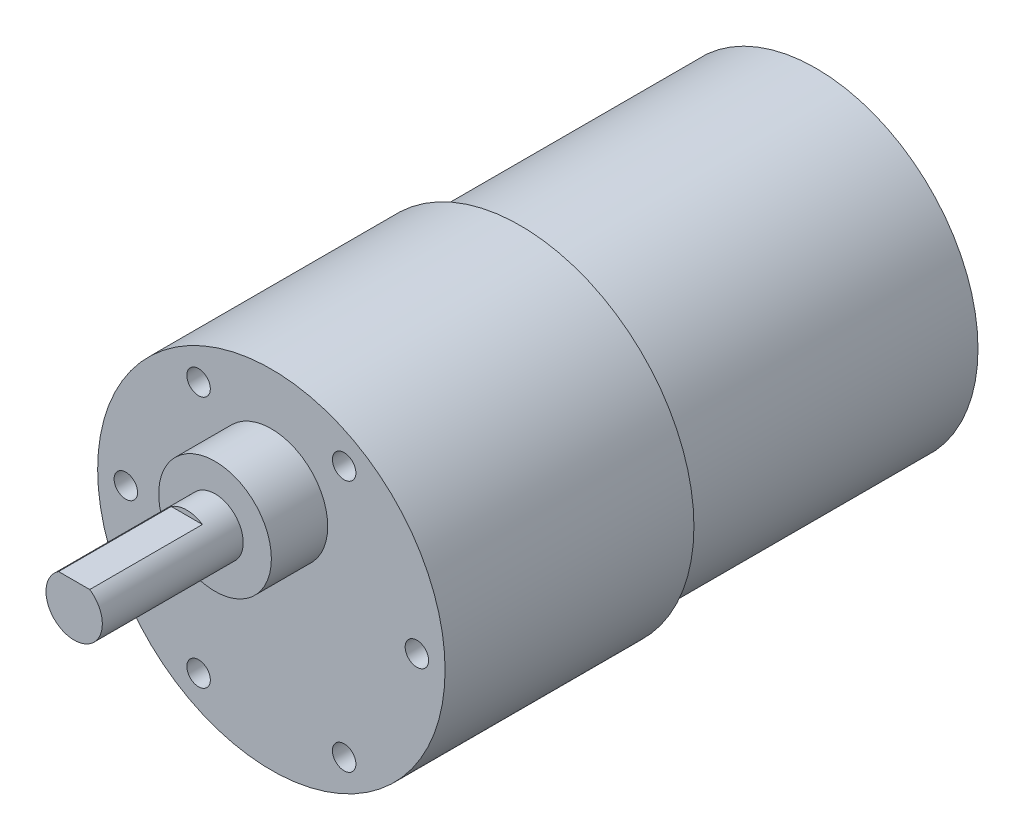
ISO-10303-21;
HEADER;
FILE_DESCRIPTION(('STEP AP214'),'2;1');
FILE_NAME('part.step','',(''),(''),'','','');
FILE_SCHEMA(('AUTOMOTIVE_DESIGN { 1 0 10303 214 1 1 1 1 }'));
ENDSEC;
DATA;
#1=APPLICATION_CONTEXT('core data for automotive mechanical design processes');
#2=APPLICATION_PROTOCOL_DEFINITION('international standard','automotive_design',2000,#1);
#3=PRODUCT_CONTEXT('',#1,'mechanical');
#4=PRODUCT('Part','Part','',(#3));
#5=PRODUCT_RELATED_PRODUCT_CATEGORY('part','',(#4));
#6=PRODUCT_DEFINITION_FORMATION('','',#4);
#7=PRODUCT_DEFINITION_CONTEXT('part definition',#1,'design');
#8=PRODUCT_DEFINITION('design','',#6,#7);
#9=PRODUCT_DEFINITION_SHAPE('','',#8);
#10=(LENGTH_UNIT() NAMED_UNIT(*) SI_UNIT(.MILLI.,.METRE.));
#11=(NAMED_UNIT(*) PLANE_ANGLE_UNIT() SI_UNIT($,.RADIAN.));
#12=(NAMED_UNIT(*) SI_UNIT($,.STERADIAN.) SOLID_ANGLE_UNIT());
#13=UNCERTAINTY_MEASURE_WITH_UNIT(LENGTH_MEASURE(1.E-05),#10,'distance_accuracy_value','');
#14=(GEOMETRIC_REPRESENTATION_CONTEXT(3) GLOBAL_UNCERTAINTY_ASSIGNED_CONTEXT((#13)) GLOBAL_UNIT_ASSIGNED_CONTEXT((#10,
#11,#12)) REPRESENTATION_CONTEXT('',''));
#15=CARTESIAN_POINT('',(0.,0.,0.));
#16=DIRECTION('',(0.,0.,1.));
#17=DIRECTION('',(1.,0.,0.));
#18=AXIS2_PLACEMENT_3D('',#15,#16,#17);
#19=CARTESIAN_POINT('',(0.,0.,29.));
#20=DIRECTION('',(0.,0.,-1.));
#21=DIRECTION('',(-1.,0.,0.));
#22=AXIS2_PLACEMENT_3D('',#19,#20,#21);
#23=CYLINDRICAL_SURFACE('',#22,18.5);
#24=CARTESIAN_POINT('',(0.,0.,29.));
#25=DIRECTION('',(0.,0.,1.));
#26=DIRECTION('',(1.,0.,0.));
#27=AXIS2_PLACEMENT_3D('',#24,#25,#26);
#28=CIRCLE('',#27,18.5);
#29=CARTESIAN_POINT('',(-18.5,0.,29.));
#30=VERTEX_POINT('',#29);
#31=EDGE_CURVE('E11',#30,#30,#28,.T.);
#32=CARTESIAN_POINT('',(0.,0.,2.5));
#33=DIRECTION('',(0.,0.,-1.));
#34=DIRECTION('',(-1.,0.,0.));
#35=AXIS2_PLACEMENT_3D('',#32,#33,#34);
#36=CIRCLE('',#35,18.5);
#37=CARTESIAN_POINT('',(-18.5,0.,2.5));
#38=VERTEX_POINT('',#37);
#39=EDGE_CURVE('E41',#38,#38,#36,.T.);
#40=CARTESIAN_POINT('',(-18.5,0.,29.));
#41=CARTESIAN_POINT('',(-18.5,0.,28.7239583333333));
#42=CARTESIAN_POINT('',(-18.5,0.,28.4479166666667));
#43=CARTESIAN_POINT('',(-18.5,0.,27.8958333333333));
#44=CARTESIAN_POINT('',(-18.5,0.,27.6197916666667));
#45=CARTESIAN_POINT('',(-18.5,0.,27.0677083333333));
#46=CARTESIAN_POINT('',(-18.5,0.,26.7916666666667));
#47=CARTESIAN_POINT('',(-18.5,0.,26.2395833333333));
#48=CARTESIAN_POINT('',(-18.5,0.,25.9635416666667));
#49=CARTESIAN_POINT('',(-18.5,0.,25.4114583333333));
#50=CARTESIAN_POINT('',(-18.5,0.,25.1354166666667));
#51=CARTESIAN_POINT('',(-18.5,0.,24.5833333333333));
#52=CARTESIAN_POINT('',(-18.5,0.,24.3072916666667));
#53=CARTESIAN_POINT('',(-18.5,0.,23.7552083333333));
#54=CARTESIAN_POINT('',(-18.5,0.,23.4791666666667));
#55=CARTESIAN_POINT('',(-18.5,0.,22.9270833333333));
#56=CARTESIAN_POINT('',(-18.5,0.,22.6510416666667));
#57=CARTESIAN_POINT('',(-18.5,0.,22.0989583333333));
#58=CARTESIAN_POINT('',(-18.5,0.,21.8229166666667));
#59=CARTESIAN_POINT('',(-18.5,0.,21.2708333333333));
#60=CARTESIAN_POINT('',(-18.5,0.,20.9947916666667));
#61=CARTESIAN_POINT('',(-18.5,0.,20.4427083333333));
#62=CARTESIAN_POINT('',(-18.5,0.,20.1666666666667));
#63=CARTESIAN_POINT('',(-18.5,0.,19.6145833333333));
#64=CARTESIAN_POINT('',(-18.5,0.,19.3385416666667));
#65=CARTESIAN_POINT('',(-18.5,0.,18.7864583333333));
#66=CARTESIAN_POINT('',(-18.5,0.,18.5104166666667));
#67=CARTESIAN_POINT('',(-18.5,0.,17.9583333333333));
#68=CARTESIAN_POINT('',(-18.5,0.,17.6822916666667));
#69=CARTESIAN_POINT('',(-18.5,0.,17.1302083333333));
#70=CARTESIAN_POINT('',(-18.5,0.,16.8541666666667));
#71=CARTESIAN_POINT('',(-18.5,0.,16.3020833333333));
#72=CARTESIAN_POINT('',(-18.5,0.,16.0260416666667));
#73=CARTESIAN_POINT('',(-18.5,0.,15.4739583333333));
#74=CARTESIAN_POINT('',(-18.5,0.,15.1979166666667));
#75=CARTESIAN_POINT('',(-18.5,0.,14.6458333333333));
#76=CARTESIAN_POINT('',(-18.5,0.,14.3697916666667));
#77=CARTESIAN_POINT('',(-18.5,0.,13.8177083333333));
#78=CARTESIAN_POINT('',(-18.5,0.,13.5416666666667));
#79=CARTESIAN_POINT('',(-18.5,0.,12.9895833333333));
#80=CARTESIAN_POINT('',(-18.5,0.,12.7135416666667));
#81=CARTESIAN_POINT('',(-18.5,0.,12.1614583333333));
#82=CARTESIAN_POINT('',(-18.5,0.,11.8854166666667));
#83=CARTESIAN_POINT('',(-18.5,0.,11.3333333333333));
#84=CARTESIAN_POINT('',(-18.5,0.,11.0572916666667));
#85=CARTESIAN_POINT('',(-18.5,0.,10.5052083333333));
#86=CARTESIAN_POINT('',(-18.5,0.,10.2291666666667));
#87=CARTESIAN_POINT('',(-18.5,0.,9.67708333333334));
#88=CARTESIAN_POINT('',(-18.5,0.,9.40104166666667));
#89=CARTESIAN_POINT('',(-18.5,0.,8.84895833333334));
#90=CARTESIAN_POINT('',(-18.5,0.,8.57291666666667));
#91=CARTESIAN_POINT('',(-18.5,0.,8.02083333333334));
#92=CARTESIAN_POINT('',(-18.5,0.,7.74479166666667));
#93=CARTESIAN_POINT('',(-18.5,0.,7.19270833333334));
#94=CARTESIAN_POINT('',(-18.5,0.,6.91666666666667));
#95=CARTESIAN_POINT('',(-18.5,0.,6.36458333333334));
#96=CARTESIAN_POINT('',(-18.5,0.,6.08854166666667));
#97=CARTESIAN_POINT('',(-18.5,0.,5.53645833333333));
#98=CARTESIAN_POINT('',(-18.5,0.,5.26041666666667));
#99=CARTESIAN_POINT('',(-18.5,0.,4.70833333333334));
#100=CARTESIAN_POINT('',(-18.5,0.,4.43229166666667));
#101=CARTESIAN_POINT('',(-18.5,0.,3.88020833333334));
#102=CARTESIAN_POINT('',(-18.5,0.,3.60416666666667));
#103=CARTESIAN_POINT('',(-18.5,0.,3.05208333333333));
#104=CARTESIAN_POINT('',(-18.5,0.,2.77604166666667));
#105=CARTESIAN_POINT('',(-18.5,0.,2.5));
#106=B_SPLINE_CURVE_WITH_KNOTS('',3,(#40,#41,#42,#43,#44,#45,#46,#47,#48,#49,#50,#51,#52,#53,
#54,#55,#56,#57,#58,#59,#60,#61,#62,#63,#64,#65,#66,#67,#68,#69,#70,#71,#72,#73,#74,#75,#76,#77,
#78,#79,#80,#81,#82,#83,#84,#85,#86,#87,#88,#89,#90,#91,#92,#93,#94,#95,#96,#97,#98,#99,#100,
#101,#102,#103,#104,#105),.UNSPECIFIED.,.F.,.F.,(4,2,2,2,2,2,2,2,2,2,2,2,2,2,2,2,2,2,2,2,2,2,2,
2,2,2,2,2,2,2,2,2,4),(0.,0.828125000000002,1.65625,2.484375,3.3125,4.140625,4.96875,5.796875,
6.625,7.453125,8.28125,9.109375,9.9375,10.765625,11.59375,12.421875,13.25,14.078125,14.90625,
15.734375,16.5625,17.390625,18.21875,19.046875,19.875,20.703125,21.53125,22.359375,23.1875,
24.015625,24.84375,25.671875,26.5),.UNSPECIFIED.);
#107=EDGE_CURVE('BSEAM34',#30,#38,#106,.T.);
#108=ORIENTED_EDGE('',*,*,#31,.F.);
#109=ORIENTED_EDGE('',*,*,#39,.F.);
#110=ORIENTED_EDGE('',*,*,#107,.T.);
#111=ORIENTED_EDGE('',*,*,#107,.F.);
#112=EDGE_LOOP('',(#108,#110,#109,#111));
#113=FACE_BOUND('',#112,.T.);
#114=ADVANCED_FACE('F34',(#113),#23,.T.);
#115=CARTESIAN_POINT('',(0.,0.,29.));
#116=DIRECTION('',(0.,0.,1.));
#117=DIRECTION('',(1.,0.,0.));
#118=AXIS2_PLACEMENT_3D('',#115,#116,#117);
#119=PLANE('',#118);
#120=CARTESIAN_POINT('',(-15.5,0.,29.));
#121=DIRECTION('',(0.,0.,1.));
#122=DIRECTION('',(-0.500000000000004,0.866025403784436,0.));
#123=AXIS2_PLACEMENT_3D('',#120,#121,#122);
#124=CIRCLE('',#123,1.24999999999999);
#125=CARTESIAN_POINT('',(-16.125,1.08253175473048,29.));
#126=VERTEX_POINT('',#125);
#127=EDGE_CURVE('E91',#126,#126,#124,.T.);
#128=ORIENTED_EDGE('',*,*,#127,.F.);
#129=EDGE_LOOP('',(#128));
#130=FACE_BOUND('',#129,.T.);
#131=CARTESIAN_POINT('',(-7.75000000000002,-13.4233937586588,29.));
#132=DIRECTION('',(0.,0.,1.));
#133=DIRECTION('',(-1.,0.,0.));
#134=AXIS2_PLACEMENT_3D('',#131,#132,#133);
#135=CIRCLE('',#134,1.24999999999999);
#136=CARTESIAN_POINT('',(-9.00000000000001,-13.4233937586588,29.));
#137=VERTEX_POINT('',#136);
#138=EDGE_CURVE('E100',#137,#137,#135,.T.);
#139=ORIENTED_EDGE('',*,*,#138,.F.);
#140=EDGE_LOOP('',(#139));
#141=FACE_BOUND('',#140,.T.);
#142=CARTESIAN_POINT('',(7.75000000000011,-13.4233937586587,29.));
#143=DIRECTION('',(0.,0.,1.));
#144=DIRECTION('',(-0.499999999999992,-0.866025403784443,0.));
#145=AXIS2_PLACEMENT_3D('',#142,#143,#144);
#146=CIRCLE('',#145,1.24999999999999);
#147=CARTESIAN_POINT('',(7.12500000000012,-14.5059255133893,29.));
#148=VERTEX_POINT('',#147);
#149=EDGE_CURVE('E106',#148,#148,#146,.T.);
#150=ORIENTED_EDGE('',*,*,#149,.F.);
#151=EDGE_LOOP('',(#150));
#152=FACE_BOUND('',#151,.T.);
#153=CARTESIAN_POINT('',(15.5,1.62196645003831E-13,29.));
#154=DIRECTION('',(0.,0.,1.));
#155=DIRECTION('',(0.50000000000001,-0.866025403784433,0.));
#156=AXIS2_PLACEMENT_3D('',#153,#154,#155);
#157=CIRCLE('',#156,1.24999999999999);
#158=CARTESIAN_POINT('',(16.125,-1.08253175473037,29.));
#159=VERTEX_POINT('',#158);
#160=EDGE_CURVE('E112',#159,#159,#157,.T.);
#161=ORIENTED_EDGE('',*,*,#160,.F.);
#162=EDGE_LOOP('',(#161));
#163=FACE_BOUND('',#162,.T.);
#164=CARTESIAN_POINT('',(-7.75000000000002,13.4233937586588,29.));
#165=DIRECTION('',(0.,0.,1.));
#166=DIRECTION('',(0.499999999999998,0.86602540378444,0.));
#167=AXIS2_PLACEMENT_3D('',#164,#165,#166);
#168=CIRCLE('',#167,1.24999999999999);
#169=CARTESIAN_POINT('',(-7.12500000000002,14.5059255133893,29.));
#170=VERTEX_POINT('',#169);
#171=EDGE_CURVE('E90',#170,#170,#168,.T.);
#172=ORIENTED_EDGE('',*,*,#171,.F.);
#173=EDGE_LOOP('',(#172));
#174=FACE_BOUND('',#173,.T.);
#175=CARTESIAN_POINT('',(7.75000000000002,13.4233937586588,29.));
#176=DIRECTION('',(0.,0.,1.));
#177=DIRECTION('',(1.,0.,0.));
#178=AXIS2_PLACEMENT_3D('',#175,#176,#177);
#179=CIRCLE('',#178,1.24999999999999);
#180=CARTESIAN_POINT('',(9.00000000000001,13.4233937586588,29.));
#181=VERTEX_POINT('',#180);
#182=EDGE_CURVE('E119',#181,#181,#179,.T.);
#183=ORIENTED_EDGE('',*,*,#182,.F.);
#184=EDGE_LOOP('',(#183));
#185=FACE_BOUND('',#184,.T.);
#186=CARTESIAN_POINT('',(0.,7.,29.));
#187=DIRECTION('',(0.,0.,1.));
#188=DIRECTION('',(1.,0.,0.));
#189=AXIS2_PLACEMENT_3D('',#186,#187,#188);
#190=CIRCLE('',#189,6.);
#191=CARTESIAN_POINT('',(6.,7.,29.));
#192=VERTEX_POINT('',#191);
#193=EDGE_CURVE('E136',#192,#192,#190,.T.);
#194=ORIENTED_EDGE('',*,*,#193,.F.);
#195=EDGE_LOOP('',(#194));
#196=FACE_BOUND('',#195,.T.);
#197=ORIENTED_EDGE('',*,*,#31,.T.);
#198=EDGE_LOOP('',(#197));
#199=FACE_BOUND('',#198,.T.);
#200=ADVANCED_FACE('F155',(#130,#141,#152,#163,#174,#185,#196,#199),#119,.T.);
#201=CARTESIAN_POINT('',(0.,0.,2.5));
#202=DIRECTION('',(0.,0.,-1.));
#203=DIRECTION('',(-1.,0.,0.));
#204=AXIS2_PLACEMENT_3D('',#201,#202,#203);
#205=PLANE('',#204);
#206=CARTESIAN_POINT('',(0.,0.,2.5));
#207=DIRECTION('',(0.,0.,-1.));
#208=DIRECTION('',(-1.,0.,0.));
#209=AXIS2_PLACEMENT_3D('',#206,#207,#208);
#210=CIRCLE('',#209,17.25);
#211=CARTESIAN_POINT('',(-17.25,0.,2.5));
#212=VERTEX_POINT('',#211);
#213=EDGE_CURVE('E145',#212,#212,#210,.T.);
#214=ORIENTED_EDGE('',*,*,#213,.F.);
#215=EDGE_LOOP('',(#214));
#216=FACE_BOUND('',#215,.T.);
#217=ORIENTED_EDGE('',*,*,#39,.T.);
#218=EDGE_LOOP('',(#217));
#219=FACE_BOUND('',#218,.T.);
#220=ADVANCED_FACE('F152',(#216,#219),#205,.T.);
#221=CARTESIAN_POINT('',(0.,0.,2.5));
#222=DIRECTION('',(0.,0.,-1.));
#223=DIRECTION('',(-1.,0.,0.));
#224=AXIS2_PLACEMENT_3D('',#221,#222,#223);
#225=CYLINDRICAL_SURFACE('',#224,17.25);
#226=ORIENTED_EDGE('',*,*,#213,.T.);
#227=EDGE_LOOP('',(#226));
#228=FACE_BOUND('',#227,.T.);
#229=CARTESIAN_POINT('',(0.,0.,-29.));
#230=DIRECTION('',(0.,0.,-1.));
#231=DIRECTION('',(-1.,0.,0.));
#232=AXIS2_PLACEMENT_3D('',#229,#230,#231);
#233=CIRCLE('',#232,17.25);
#234=CARTESIAN_POINT('',(-17.25,0.,-29.));
#235=VERTEX_POINT('',#234);
#236=EDGE_CURVE('E142',#235,#235,#233,.T.);
#237=ORIENTED_EDGE('',*,*,#236,.F.);
#238=EDGE_LOOP('',(#237));
#239=FACE_BOUND('',#238,.T.);
#240=ADVANCED_FACE('F167',(#228,#239),#225,.T.);
#241=CARTESIAN_POINT('',(0.,0.,-29.));
#242=DIRECTION('',(0.,0.,1.));
#243=DIRECTION('',(1.,0.,0.));
#244=AXIS2_PLACEMENT_3D('',#241,#242,#243);
#245=PLANE('',#244);
#246=ORIENTED_EDGE('',*,*,#236,.T.);
#247=EDGE_LOOP('',(#246));
#248=FACE_BOUND('',#247,.T.);
#249=ADVANCED_FACE('F173',(#248),#245,.F.);
#250=CARTESIAN_POINT('',(0.,7.,35.));
#251=DIRECTION('',(0.,0.,-1.));
#252=DIRECTION('',(-1.,0.,0.));
#253=AXIS2_PLACEMENT_3D('',#250,#251,#252);
#254=CYLINDRICAL_SURFACE('',#253,6.);
#255=CARTESIAN_POINT('',(0.,7.,35.));
#256=DIRECTION('',(0.,0.,1.));
#257=DIRECTION('',(1.,0.,0.));
#258=AXIS2_PLACEMENT_3D('',#255,#256,#257);
#259=CIRCLE('',#258,6.);
#260=CARTESIAN_POINT('',(6.,7.,35.));
#261=VERTEX_POINT('',#260);
#262=EDGE_CURVE('E139',#261,#261,#259,.T.);
#263=ORIENTED_EDGE('',*,*,#262,.F.);
#264=EDGE_LOOP('',(#263));
#265=FACE_BOUND('',#264,.T.);
#266=ORIENTED_EDGE('',*,*,#193,.T.);
#267=EDGE_LOOP('',(#266));
#268=FACE_BOUND('',#267,.T.);
#269=ADVANCED_FACE('F175',(#265,#268),#254,.T.);
#270=CARTESIAN_POINT('',(0.,7.,35.));
#271=DIRECTION('',(0.,0.,1.));
#272=DIRECTION('',(1.,0.,0.));
#273=AXIS2_PLACEMENT_3D('',#270,#271,#272);
#274=PLANE('',#273);
#275=CARTESIAN_POINT('',(0.,7.,35.));
#276=DIRECTION('',(0.,0.,1.));
#277=DIRECTION('',(1.,0.,0.));
#278=AXIS2_PLACEMENT_3D('',#275,#276,#277);
#279=CIRCLE('',#278,3.);
#280=CARTESIAN_POINT('',(3.,7.,35.));
#281=VERTEX_POINT('',#280);
#282=EDGE_CURVE('E131',#281,#281,#279,.T.);
#283=ORIENTED_EDGE('',*,*,#282,.F.);
#284=EDGE_LOOP('',(#283));
#285=FACE_BOUND('',#284,.T.);
#286=ORIENTED_EDGE('',*,*,#262,.T.);
#287=EDGE_LOOP('',(#286));
#288=FACE_BOUND('',#287,.T.);
#289=ADVANCED_FACE('F181',(#285,#288),#274,.T.);
#290=CARTESIAN_POINT('',(0.,7.,50.));
#291=DIRECTION('',(0.,0.,-1.));
#292=DIRECTION('',(-1.,0.,0.));
#293=AXIS2_PLACEMENT_3D('',#290,#291,#292);
#294=CYLINDRICAL_SURFACE('',#293,3.);
#295=CARTESIAN_POINT('',(0.,7.,50.));
#296=DIRECTION('',(0.,0.,1.));
#297=DIRECTION('',(1.,0.,0.));
#298=AXIS2_PLACEMENT_3D('',#295,#296,#297);
#299=CIRCLE('',#298,3.);
#300=CARTESIAN_POINT('',(-1.6583123951777,9.5,50.));
#301=VERTEX_POINT('',#300);
#302=CARTESIAN_POINT('',(1.6583123951777,9.5,50.));
#303=VERTEX_POINT('',#302);
#304=EDGE_CURVE('E133',#301,#303,#299,.T.);
#305=ORIENTED_EDGE('',*,*,#304,.F.);
#306=DIRECTION('',(0.,0.,1.));
#307=VECTOR('',#306,1.);
#308=CARTESIAN_POINT('',(-1.6583123951777,9.5,38.));
#309=LINE('',#308,#307);
#310=CARTESIAN_POINT('',(-1.6583123951777,9.5,38.));
#311=VERTEX_POINT('',#310);
#312=EDGE_CURVE('E48',#311,#301,#309,.T.);
#313=ORIENTED_EDGE('',*,*,#312,.F.);
#314=CARTESIAN_POINT('',(0.,7.,38.));
#315=DIRECTION('',(0.,0.,1.));
#316=DIRECTION('',(1.,0.,0.));
#317=AXIS2_PLACEMENT_3D('',#314,#315,#316);
#318=CIRCLE('',#317,3.);
#319=CARTESIAN_POINT('',(1.6583123951777,9.5,38.));
#320=VERTEX_POINT('',#319);
#321=EDGE_CURVE('E125',#320,#311,#318,.T.);
#322=ORIENTED_EDGE('',*,*,#321,.F.);
#323=DIRECTION('',(0.,0.,1.));
#324=VECTOR('',#323,1.);
#325=CARTESIAN_POINT('',(1.6583123951777,9.5,38.));
#326=LINE('',#325,#324);
#327=EDGE_CURVE('E54',#320,#303,#326,.T.);
#328=ORIENTED_EDGE('',*,*,#327,.T.);
#329=EDGE_LOOP('',(#305,#313,#322,#328));
#330=FACE_BOUND('',#329,.T.);
#331=ORIENTED_EDGE('',*,*,#282,.T.);
#332=EDGE_LOOP('',(#331));
#333=FACE_BOUND('',#332,.T.);
#334=ADVANCED_FACE('F192',(#330,#333),#294,.T.);
#335=CARTESIAN_POINT('',(0.,7.,50.));
#336=DIRECTION('',(0.,0.,1.));
#337=DIRECTION('',(1.,0.,0.));
#338=AXIS2_PLACEMENT_3D('',#335,#336,#337);
#339=PLANE('',#338);
#340=DIRECTION('',(1.,0.,0.));
#341=VECTOR('',#340,1.);
#342=CARTESIAN_POINT('',(-1.6583123951777,9.5,50.));
#343=LINE('',#342,#341);
#344=EDGE_CURVE('E61',#301,#303,#343,.T.);
#345=ORIENTED_EDGE('',*,*,#344,.F.);
#346=ORIENTED_EDGE('',*,*,#304,.T.);
#347=EDGE_LOOP('',(#345,#346));
#348=FACE_BOUND('',#347,.T.);
#349=ADVANCED_FACE('F196',(#348),#339,.T.);
#350=CARTESIAN_POINT('',(-1.6583123951777,9.5,38.));
#351=DIRECTION('',(0.,-1.,0.));
#352=DIRECTION('',(0.,0.,-1.));
#353=AXIS2_PLACEMENT_3D('',#350,#351,#352);
#354=PLANE('',#353);
#355=ORIENTED_EDGE('',*,*,#344,.T.);
#356=ORIENTED_EDGE('',*,*,#327,.F.);
#357=DIRECTION('',(1.,0.,0.));
#358=VECTOR('',#357,1.);
#359=CARTESIAN_POINT('',(-1.6583123951777,9.5,38.));
#360=LINE('',#359,#358);
#361=EDGE_CURVE('E127',#311,#320,#360,.T.);
#362=ORIENTED_EDGE('',*,*,#361,.F.);
#363=ORIENTED_EDGE('',*,*,#312,.T.);
#364=EDGE_LOOP('',(#355,#356,#362,#363));
#365=FACE_BOUND('',#364,.T.);
#366=ADVANCED_FACE('F200',(#365),#354,.F.);
#367=CARTESIAN_POINT('',(0.,7.,38.));
#368=DIRECTION('',(0.,0.,1.));
#369=DIRECTION('',(1.,0.,0.));
#370=AXIS2_PLACEMENT_3D('',#367,#368,#369);
#371=PLANE('',#370);
#372=ORIENTED_EDGE('',*,*,#321,.T.);
#373=ORIENTED_EDGE('',*,*,#361,.T.);
#374=EDGE_LOOP('',(#372,#373));
#375=FACE_BOUND('',#374,.T.);
#376=ADVANCED_FACE('F204',(#375),#371,.T.);
#377=CARTESIAN_POINT('',(7.75000000000002,13.4233937586588,25.5));
#378=DIRECTION('',(0.,0.,1.));
#379=DIRECTION('',(1.,0.,0.));
#380=AXIS2_PLACEMENT_3D('',#377,#378,#379);
#381=CONICAL_SURFACE('',#380,1.25,1.02974425867665);
#382=CARTESIAN_POINT('',(7.75000000000002,13.4233937586588,24.7489242262155));
#383=VERTEX_POINT('',#382);
#384=VERTEX_LOOP('',#383);
#385=FACE_BOUND('',#384,.T.);
#386=CARTESIAN_POINT('',(7.75000000000002,13.4233937586588,25.5));
#387=DIRECTION('',(0.,0.,1.));
#388=DIRECTION('',(1.,0.,0.));
#389=AXIS2_PLACEMENT_3D('',#386,#387,#388);
#390=CIRCLE('',#389,1.25);
#391=CARTESIAN_POINT('',(9.00000000000001,13.4233937586588,25.5));
#392=VERTEX_POINT('',#391);
#393=EDGE_CURVE('E122',#392,#392,#390,.T.);
#394=ORIENTED_EDGE('',*,*,#393,.T.);
#395=EDGE_LOOP('',(#394));
#396=FACE_BOUND('',#395,.T.);
#397=ADVANCED_FACE('F207',(#385,#396),#381,.F.);
#398=CARTESIAN_POINT('',(7.75000000000002,13.4233937586588,29.));
#399=DIRECTION('',(0.,0.,1.));
#400=DIRECTION('',(1.,0.,0.));
#401=AXIS2_PLACEMENT_3D('',#398,#399,#400);
#402=CYLINDRICAL_SURFACE('',#401,1.24999999999999);
#403=ORIENTED_EDGE('',*,*,#393,.F.);
#404=EDGE_LOOP('',(#403));
#405=FACE_BOUND('',#404,.T.);
#406=ORIENTED_EDGE('',*,*,#182,.T.);
#407=EDGE_LOOP('',(#406));
#408=FACE_BOUND('',#407,.T.);
#409=ADVANCED_FACE('F211',(#405,#408),#402,.F.);
#410=CARTESIAN_POINT('',(-7.75000000000002,13.4233937586588,25.5));
#411=DIRECTION('',(0.,0.,1.));
#412=DIRECTION('',(0.499999999999998,0.86602540378444,0.));
#413=AXIS2_PLACEMENT_3D('',#410,#411,#412);
#414=CONICAL_SURFACE('',#413,1.25,1.02974425867665);
#415=CARTESIAN_POINT('',(-7.75000000000002,13.4233937586588,24.7489242262155));
#416=VERTEX_POINT('',#415);
#417=VERTEX_LOOP('',#416);
#418=FACE_BOUND('',#417,.T.);
#419=CARTESIAN_POINT('',(-7.75000000000002,13.4233937586588,25.5));
#420=DIRECTION('',(0.,0.,1.));
#421=DIRECTION('',(0.499999999999998,0.86602540378444,0.));
#422=AXIS2_PLACEMENT_3D('',#419,#420,#421);
#423=CIRCLE('',#422,1.25);
#424=CARTESIAN_POINT('',(-7.12500000000002,14.5059255133893,25.5));
#425=VERTEX_POINT('',#424);
#426=EDGE_CURVE('E94',#425,#425,#423,.T.);
#427=ORIENTED_EDGE('',*,*,#426,.T.);
#428=EDGE_LOOP('',(#427));
#429=FACE_BOUND('',#428,.T.);
#430=ADVANCED_FACE('F214',(#418,#429),#414,.F.);
#431=CARTESIAN_POINT('',(-7.75000000000002,13.4233937586588,29.));
#432=DIRECTION('',(0.,0.,1.));
#433=DIRECTION('',(0.499999999999998,0.86602540378444,0.));
#434=AXIS2_PLACEMENT_3D('',#431,#432,#433);
#435=CYLINDRICAL_SURFACE('',#434,1.24999999999999);
#436=ORIENTED_EDGE('',*,*,#426,.F.);
#437=EDGE_LOOP('',(#436));
#438=FACE_BOUND('',#437,.T.);
#439=ORIENTED_EDGE('',*,*,#171,.T.);
#440=EDGE_LOOP('',(#439));
#441=FACE_BOUND('',#440,.T.);
#442=ADVANCED_FACE('F218',(#438,#441),#435,.F.);
#443=CARTESIAN_POINT('',(15.5,1.62196645003831E-13,25.5));
#444=DIRECTION('',(0.,0.,1.));
#445=DIRECTION('',(0.50000000000001,-0.866025403784433,0.));
#446=AXIS2_PLACEMENT_3D('',#443,#444,#445);
#447=CONICAL_SURFACE('',#446,1.25,1.02974425867665);
#448=CARTESIAN_POINT('',(15.5,1.6306400674182E-13,24.7489242262155));
#449=VERTEX_POINT('',#448);
#450=VERTEX_LOOP('',#449);
#451=FACE_BOUND('',#450,.T.);
#452=CARTESIAN_POINT('',(15.5,1.62196645003831E-13,25.5));
#453=DIRECTION('',(0.,0.,1.));
#454=DIRECTION('',(0.50000000000001,-0.866025403784433,0.));
#455=AXIS2_PLACEMENT_3D('',#452,#453,#454);
#456=CIRCLE('',#455,1.25);
#457=CARTESIAN_POINT('',(16.125,-1.08253175473038,25.5));
#458=VERTEX_POINT('',#457);
#459=EDGE_CURVE('E109',#458,#458,#456,.T.);
#460=ORIENTED_EDGE('',*,*,#459,.T.);
#461=EDGE_LOOP('',(#460));
#462=FACE_BOUND('',#461,.T.);
#463=ADVANCED_FACE('F222',(#451,#462),#447,.F.);
#464=CARTESIAN_POINT('',(15.5,1.62196645003831E-13,29.));
#465=DIRECTION('',(0.,0.,1.));
#466=DIRECTION('',(0.50000000000001,-0.866025403784433,0.));
#467=AXIS2_PLACEMENT_3D('',#464,#465,#466);
#468=CYLINDRICAL_SURFACE('',#467,1.24999999999999);
#469=ORIENTED_EDGE('',*,*,#459,.F.);
#470=EDGE_LOOP('',(#469));
#471=FACE_BOUND('',#470,.T.);
#472=ORIENTED_EDGE('',*,*,#160,.T.);
#473=EDGE_LOOP('',(#472));
#474=FACE_BOUND('',#473,.T.);
#475=ADVANCED_FACE('F226',(#471,#474),#468,.F.);
#476=CARTESIAN_POINT('',(7.75000000000011,-13.4233937586587,25.5));
#477=DIRECTION('',(0.,0.,1.));
#478=DIRECTION('',(-0.499999999999992,-0.866025403784443,0.));
#479=AXIS2_PLACEMENT_3D('',#476,#477,#478);
#480=CONICAL_SURFACE('',#479,1.25,1.02974425867665);
#481=CARTESIAN_POINT('',(7.75000000000011,-13.4233937586587,24.7489242262155));
#482=VERTEX_POINT('',#481);
#483=VERTEX_LOOP('',#482);
#484=FACE_BOUND('',#483,.T.);
#485=CARTESIAN_POINT('',(7.75000000000011,-13.4233937586587,25.5));
#486=DIRECTION('',(0.,0.,1.));
#487=DIRECTION('',(-0.499999999999992,-0.866025403784443,0.));
#488=AXIS2_PLACEMENT_3D('',#485,#486,#487);
#489=CIRCLE('',#488,1.25);
#490=CARTESIAN_POINT('',(7.12500000000012,-14.5059255133893,25.5));
#491=VERTEX_POINT('',#490);
#492=EDGE_CURVE('E103',#491,#491,#489,.T.);
#493=ORIENTED_EDGE('',*,*,#492,.T.);
#494=EDGE_LOOP('',(#493));
#495=FACE_BOUND('',#494,.T.);
#496=ADVANCED_FACE('F230',(#484,#495),#480,.F.);
#497=CARTESIAN_POINT('',(7.75000000000011,-13.4233937586587,29.));
#498=DIRECTION('',(0.,0.,1.));
#499=DIRECTION('',(-0.499999999999992,-0.866025403784443,0.));
#500=AXIS2_PLACEMENT_3D('',#497,#498,#499);
#501=CYLINDRICAL_SURFACE('',#500,1.24999999999999);
#502=ORIENTED_EDGE('',*,*,#492,.F.);
#503=EDGE_LOOP('',(#502));
#504=FACE_BOUND('',#503,.T.);
#505=ORIENTED_EDGE('',*,*,#149,.T.);
#506=EDGE_LOOP('',(#505));
#507=FACE_BOUND('',#506,.T.);
#508=ADVANCED_FACE('F234',(#504,#507),#501,.F.);
#509=CARTESIAN_POINT('',(-7.75000000000002,-13.4233937586588,25.5));
#510=DIRECTION('',(0.,0.,1.));
#511=DIRECTION('',(-1.,0.,0.));
#512=AXIS2_PLACEMENT_3D('',#509,#510,#511);
#513=CONICAL_SURFACE('',#512,1.25,1.02974425867665);
#514=CARTESIAN_POINT('',(-7.75000000000002,-13.4233937586588,24.7489242262155));
#515=VERTEX_POINT('',#514);
#516=VERTEX_LOOP('',#515);
#517=FACE_BOUND('',#516,.T.);
#518=CARTESIAN_POINT('',(-7.75000000000002,-13.4233937586588,25.5));
#519=DIRECTION('',(0.,0.,1.));
#520=DIRECTION('',(-1.,0.,0.));
#521=AXIS2_PLACEMENT_3D('',#518,#519,#520);
#522=CIRCLE('',#521,1.25);
#523=CARTESIAN_POINT('',(-9.00000000000001,-13.4233937586588,25.5));
#524=VERTEX_POINT('',#523);
#525=EDGE_CURVE('E97',#524,#524,#522,.T.);
#526=ORIENTED_EDGE('',*,*,#525,.T.);
#527=EDGE_LOOP('',(#526));
#528=FACE_BOUND('',#527,.T.);
#529=ADVANCED_FACE('F238',(#517,#528),#513,.F.);
#530=CARTESIAN_POINT('',(-7.75000000000002,-13.4233937586588,29.));
#531=DIRECTION('',(0.,0.,1.));
#532=DIRECTION('',(-1.,0.,0.));
#533=AXIS2_PLACEMENT_3D('',#530,#531,#532);
#534=CYLINDRICAL_SURFACE('',#533,1.24999999999999);
#535=ORIENTED_EDGE('',*,*,#525,.F.);
#536=EDGE_LOOP('',(#535));
#537=FACE_BOUND('',#536,.T.);
#538=ORIENTED_EDGE('',*,*,#138,.T.);
#539=EDGE_LOOP('',(#538));
#540=FACE_BOUND('',#539,.T.);
#541=ADVANCED_FACE('F84',(#537,#540),#534,.F.);
#542=CARTESIAN_POINT('',(-15.5,0.,25.5));
#543=DIRECTION('',(0.,0.,1.));
#544=DIRECTION('',(-0.500000000000004,0.866025403784436,0.));
#545=AXIS2_PLACEMENT_3D('',#542,#543,#544);
#546=CONICAL_SURFACE('',#545,1.25,1.02974425867665);
#547=CARTESIAN_POINT('',(-15.5,0.,24.7489242262155));
#548=VERTEX_POINT('',#547);
#549=VERTEX_LOOP('',#548);
#550=FACE_BOUND('',#549,.T.);
#551=CARTESIAN_POINT('',(-15.5,0.,25.5));
#552=DIRECTION('',(0.,0.,1.));
#553=DIRECTION('',(-0.500000000000004,0.866025403784436,0.));
#554=AXIS2_PLACEMENT_3D('',#551,#552,#553);
#555=CIRCLE('',#554,1.25);
#556=CARTESIAN_POINT('',(-16.125,1.08253175473049,25.5));
#557=VERTEX_POINT('',#556);
#558=EDGE_CURVE('E88',#557,#557,#555,.T.);
#559=ORIENTED_EDGE('',*,*,#558,.T.);
#560=EDGE_LOOP('',(#559));
#561=FACE_BOUND('',#560,.T.);
#562=ADVANCED_FACE('F80',(#550,#561),#546,.F.);
#563=CARTESIAN_POINT('',(-15.5,0.,29.));
#564=DIRECTION('',(0.,0.,1.));
#565=DIRECTION('',(-0.500000000000004,0.866025403784436,0.));
#566=AXIS2_PLACEMENT_3D('',#563,#564,#565);
#567=CYLINDRICAL_SURFACE('',#566,1.24999999999999);
#568=ORIENTED_EDGE('',*,*,#558,.F.);
#569=EDGE_LOOP('',(#568));
#570=FACE_BOUND('',#569,.T.);
#571=ORIENTED_EDGE('',*,*,#127,.T.);
#572=EDGE_LOOP('',(#571));
#573=FACE_BOUND('',#572,.T.);
#574=ADVANCED_FACE('F83',(#570,#573),#567,.F.);
#575=CLOSED_SHELL('',(#114,#200,#220,#240,#249,#269,#289,#334,#349,#366,#376,#397,#409,#430,
#442,#463,#475,#496,#508,#529,#541,#562,#574));
#576=MANIFOLD_SOLID_BREP('B2',#575);
#577=ADVANCED_BREP_SHAPE_REPRESENTATION('',(#18,#576),#14);
#578=SHAPE_DEFINITION_REPRESENTATION(#9,#577);
ENDSEC;
END-ISO-10303-21;
